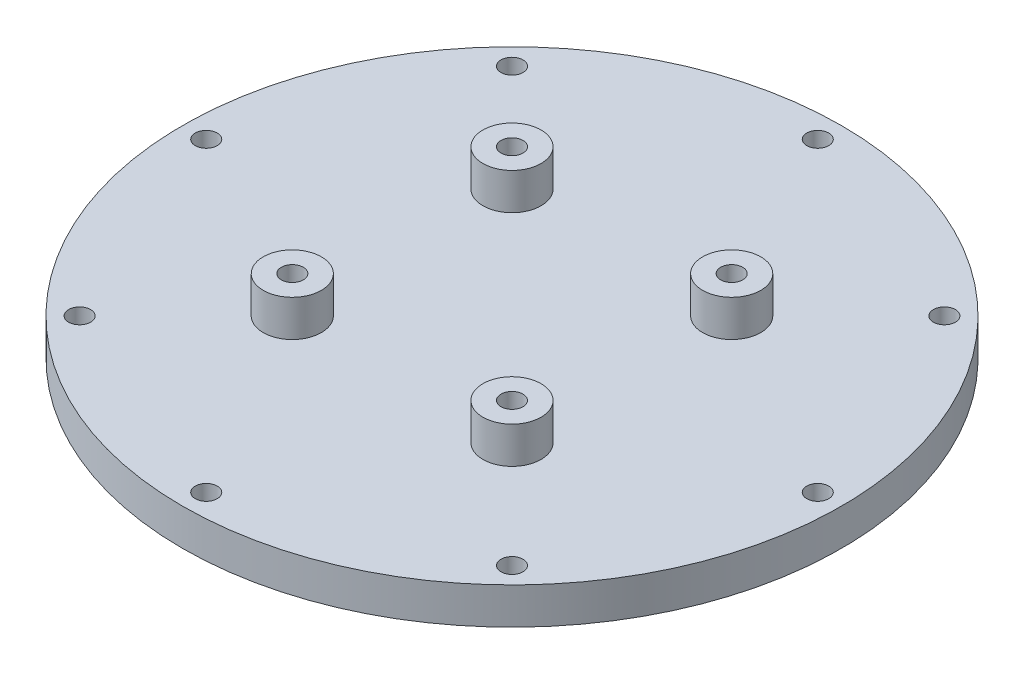
ISO-10303-21;
HEADER;
FILE_DESCRIPTION(('STEP AP214'),'2;1');
FILE_NAME('part.step','',(''),(''),'','','');
FILE_SCHEMA(('AUTOMOTIVE_DESIGN { 1 0 10303 214 1 1 1 1 }'));
ENDSEC;
DATA;
#1=APPLICATION_CONTEXT('core data for automotive mechanical design processes');
#2=APPLICATION_PROTOCOL_DEFINITION('international standard','automotive_design',2000,#1);
#3=PRODUCT_CONTEXT('',#1,'mechanical');
#4=PRODUCT('Part','Part','',(#3));
#5=PRODUCT_RELATED_PRODUCT_CATEGORY('part','',(#4));
#6=PRODUCT_DEFINITION_FORMATION('','',#4);
#7=PRODUCT_DEFINITION_CONTEXT('part definition',#1,'design');
#8=PRODUCT_DEFINITION('design','',#6,#7);
#9=PRODUCT_DEFINITION_SHAPE('','',#8);
#10=(LENGTH_UNIT() NAMED_UNIT(*) SI_UNIT(.MILLI.,.METRE.));
#11=(NAMED_UNIT(*) PLANE_ANGLE_UNIT() SI_UNIT($,.RADIAN.));
#12=(NAMED_UNIT(*) SI_UNIT($,.STERADIAN.) SOLID_ANGLE_UNIT());
#13=UNCERTAINTY_MEASURE_WITH_UNIT(LENGTH_MEASURE(1.E-05),#10,'distance_accuracy_value','');
#14=(GEOMETRIC_REPRESENTATION_CONTEXT(3) GLOBAL_UNCERTAINTY_ASSIGNED_CONTEXT((#13)) GLOBAL_UNIT_ASSIGNED_CONTEXT((#10,
#11,#12)) REPRESENTATION_CONTEXT('',''));
#15=CARTESIAN_POINT('',(0.,0.,0.));
#16=DIRECTION('',(0.,0.,1.));
#17=DIRECTION('',(1.,0.,0.));
#18=AXIS2_PLACEMENT_3D('',#15,#16,#17);
#19=CARTESIAN_POINT('',(0.,5.,0.));
#20=DIRECTION('',(0.,1.,0.));
#21=DIRECTION('',(0.,0.,1.));
#22=AXIS2_PLACEMENT_3D('',#19,#20,#21);
#23=PLANE('',#22);
#24=CARTESIAN_POINT('',(-14.9999999999997,5.,15.));
#25=DIRECTION('',(0.,1.,0.));
#26=DIRECTION('',(0.,0.,1.));
#27=AXIS2_PLACEMENT_3D('',#24,#25,#26);
#28=CIRCLE('',#27,3.96875);
#29=CARTESIAN_POINT('',(-14.9999999999997,5.,18.96875));
#30=VERTEX_POINT('',#29);
#31=EDGE_CURVE('E139',#30,#30,#28,.T.);
#32=ORIENTED_EDGE('',*,*,#31,.F.);
#33=EDGE_LOOP('',(#32));
#34=FACE_BOUND('',#33,.T.);
#35=CARTESIAN_POINT('',(15.0000000000003,5.,15.));
#36=DIRECTION('',(0.,1.,0.));
#37=DIRECTION('',(0.,0.,1.));
#38=AXIS2_PLACEMENT_3D('',#35,#36,#37);
#39=CIRCLE('',#38,3.96875);
#40=CARTESIAN_POINT('',(15.0000000000003,5.,18.96875));
#41=VERTEX_POINT('',#40);
#42=EDGE_CURVE('E153',#41,#41,#39,.T.);
#43=ORIENTED_EDGE('',*,*,#42,.F.);
#44=EDGE_LOOP('',(#43));
#45=FACE_BOUND('',#44,.T.);
#46=CARTESIAN_POINT('',(15.,5.,-15.));
#47=DIRECTION('',(0.,1.,0.));
#48=DIRECTION('',(0.,0.,1.));
#49=AXIS2_PLACEMENT_3D('',#46,#47,#48);
#50=CIRCLE('',#49,3.96875);
#51=CARTESIAN_POINT('',(15.,5.,-11.03125));
#52=VERTEX_POINT('',#51);
#53=EDGE_CURVE('E163',#52,#52,#50,.T.);
#54=ORIENTED_EDGE('',*,*,#53,.F.);
#55=EDGE_LOOP('',(#54));
#56=FACE_BOUND('',#55,.T.);
#57=CARTESIAN_POINT('',(-15.,5.,-15.));
#58=DIRECTION('',(0.,1.,0.));
#59=DIRECTION('',(0.,0.,1.));
#60=AXIS2_PLACEMENT_3D('',#57,#58,#59);
#61=CIRCLE('',#60,3.96875);
#62=CARTESIAN_POINT('',(-15.,5.,-11.03125));
#63=VERTEX_POINT('',#62);
#64=EDGE_CURVE('E122',#63,#63,#61,.T.);
#65=ORIENTED_EDGE('',*,*,#64,.F.);
#66=EDGE_LOOP('',(#65));
#67=FACE_BOUND('',#66,.T.);
#68=CARTESIAN_POINT('',(-41.7499999999995,5.,7.55688533465481E-13));
#69=DIRECTION('',(0.,1.,0.));
#70=DIRECTION('',(0.,0.,1.));
#71=AXIS2_PLACEMENT_3D('',#68,#69,#70);
#72=CIRCLE('',#71,1.50000000000129);
#73=CARTESIAN_POINT('',(-41.7499999999995,5.,1.50000000000205));
#74=VERTEX_POINT('',#73);
#75=EDGE_CURVE('E102',#74,#74,#72,.T.);
#76=ORIENTED_EDGE('',*,*,#75,.F.);
#77=EDGE_LOOP('',(#76));
#78=FACE_BOUND('',#77,.T.);
#79=CARTESIAN_POINT('',(2.52321384578816E-12,5.,41.7500000000013));
#80=DIRECTION('',(0.,1.,0.));
#81=DIRECTION('',(0.,0.,1.));
#82=AXIS2_PLACEMENT_3D('',#79,#80,#81);
#83=CIRCLE('',#82,1.50000000000233);
#84=CARTESIAN_POINT('',(2.52321384578816E-12,5.,43.2500000000036));
#85=VERTEX_POINT('',#84);
#86=EDGE_CURVE('E86',#85,#85,#83,.T.);
#87=ORIENTED_EDGE('',*,*,#86,.F.);
#88=EDGE_LOOP('',(#87));
#89=FACE_BOUND('',#88,.T.);
#90=CARTESIAN_POINT('',(41.750000000003,5.,-7.50575633079041E-13));
#91=DIRECTION('',(0.,1.,0.));
#92=DIRECTION('',(0.,0.,1.));
#93=AXIS2_PLACEMENT_3D('',#90,#91,#92);
#94=CIRCLE('',#93,1.49999999999997);
#95=CARTESIAN_POINT('',(41.750000000003,5.,1.49999999999922));
#96=VERTEX_POINT('',#95);
#97=EDGE_CURVE('E70',#96,#96,#94,.T.);
#98=ORIENTED_EDGE('',*,*,#97,.F.);
#99=EDGE_LOOP('',(#98));
#100=FACE_BOUND('',#99,.T.);
#101=CARTESIAN_POINT('',(1.02206257963007E-12,5.,-41.7500000000013));
#102=DIRECTION('',(0.,1.,0.));
#103=DIRECTION('',(0.,0.,1.));
#104=AXIS2_PLACEMENT_3D('',#101,#102,#103);
#105=CIRCLE('',#104,1.49999999999866);
#106=CARTESIAN_POINT('',(1.02206257963007E-12,5.,-40.2500000000026));
#107=VERTEX_POINT('',#106);
#108=EDGE_CURVE('E56',#107,#107,#105,.T.);
#109=ORIENTED_EDGE('',*,*,#108,.F.);
#110=EDGE_LOOP('',(#109));
#111=FACE_BOUND('',#110,.T.);
#112=CARTESIAN_POINT('',(0.,5.,0.));
#113=DIRECTION('',(0.,1.,0.));
#114=DIRECTION('',(0.,0.,1.));
#115=AXIS2_PLACEMENT_3D('',#112,#113,#114);
#116=CIRCLE('',#115,45.);
#117=CARTESIAN_POINT('',(0.,5.,45.));
#118=VERTEX_POINT('',#117);
#119=EDGE_CURVE('E10',#118,#118,#116,.T.);
#120=ORIENTED_EDGE('',*,*,#119,.T.);
#121=EDGE_LOOP('',(#120));
#122=FACE_BOUND('',#121,.T.);
#123=CARTESIAN_POINT('',(29.5217081145405,5.,-29.5217081145398));
#124=DIRECTION('',(0.,1.,0.));
#125=DIRECTION('',(0.,0.,1.));
#126=AXIS2_PLACEMENT_3D('',#123,#124,#125);
#127=CIRCLE('',#126,1.49999999999886);
#128=CARTESIAN_POINT('',(29.5217081145405,5.,-28.0217081145409));
#129=VERTEX_POINT('',#128);
#130=EDGE_CURVE('E62',#129,#129,#127,.T.);
#131=ORIENTED_EDGE('',*,*,#130,.F.);
#132=EDGE_LOOP('',(#131));
#133=FACE_BOUND('',#132,.T.);
#134=CARTESIAN_POINT('',(29.5217081145415,5.,29.5217081145387));
#135=DIRECTION('',(0.,1.,0.));
#136=DIRECTION('',(0.,0.,1.));
#137=AXIS2_PLACEMENT_3D('',#134,#135,#136);
#138=CIRCLE('',#137,1.5000000000014);
#139=CARTESIAN_POINT('',(29.5217081145415,5.,31.0217081145401));
#140=VERTEX_POINT('',#139);
#141=EDGE_CURVE('E78',#140,#140,#138,.T.);
#142=ORIENTED_EDGE('',*,*,#141,.F.);
#143=EDGE_LOOP('',(#142));
#144=FACE_BOUND('',#143,.T.);
#145=CARTESIAN_POINT('',(-29.5217081145369,5.,29.5217081145398));
#146=DIRECTION('',(0.,1.,0.));
#147=DIRECTION('',(0.,0.,1.));
#148=AXIS2_PLACEMENT_3D('',#145,#146,#147);
#149=CIRCLE('',#148,1.50000000000227);
#150=CARTESIAN_POINT('',(-29.5217081145369,5.,31.021708114542));
#151=VERTEX_POINT('',#150);
#152=EDGE_CURVE('E94',#151,#151,#149,.T.);
#153=ORIENTED_EDGE('',*,*,#152,.F.);
#154=EDGE_LOOP('',(#153));
#155=FACE_BOUND('',#154,.T.);
#156=CARTESIAN_POINT('',(-29.521708114538,5.,-29.5217081145387));
#157=DIRECTION('',(0.,1.,0.));
#158=DIRECTION('',(0.,0.,1.));
#159=AXIS2_PLACEMENT_3D('',#156,#157,#158);
#160=CIRCLE('',#159,1.5);
#161=CARTESIAN_POINT('',(-29.521708114538,5.,-28.0217081145387));
#162=VERTEX_POINT('',#161);
#163=EDGE_CURVE('E110',#162,#162,#160,.T.);
#164=ORIENTED_EDGE('',*,*,#163,.F.);
#165=EDGE_LOOP('',(#164));
#166=FACE_BOUND('',#165,.T.);
#167=ADVANCED_FACE('F43',(#34,#45,#56,#67,#78,#89,#100,#111,#122,#133,#144,#155,#166),#23,.T.);
#168=CARTESIAN_POINT('',(0.,0.,0.));
#169=DIRECTION('',(0.,1.,0.));
#170=DIRECTION('',(0.,0.,1.));
#171=AXIS2_PLACEMENT_3D('',#168,#169,#170);
#172=PLANE('',#171);
#173=CARTESIAN_POINT('',(0.,0.,0.));
#174=DIRECTION('',(0.,1.,0.));
#175=DIRECTION('',(0.,0.,1.));
#176=AXIS2_PLACEMENT_3D('',#173,#174,#175);
#177=CIRCLE('',#176,45.);
#178=CARTESIAN_POINT('',(0.,0.,45.));
#179=VERTEX_POINT('',#178);
#180=EDGE_CURVE('E47',#179,#179,#177,.T.);
#181=ORIENTED_EDGE('',*,*,#180,.F.);
#182=EDGE_LOOP('',(#181));
#183=FACE_BOUND('',#182,.T.);
#184=CARTESIAN_POINT('',(1.02206257963007E-12,0.,-41.7500000000013));
#185=DIRECTION('',(0.,1.,0.));
#186=DIRECTION('',(0.,0.,1.));
#187=AXIS2_PLACEMENT_3D('',#184,#185,#186);
#188=CIRCLE('',#187,1.49999999999866);
#189=CARTESIAN_POINT('',(1.02206257963007E-12,0.,-40.2500000000026));
#190=VERTEX_POINT('',#189);
#191=EDGE_CURVE('E58',#190,#190,#188,.T.);
#192=ORIENTED_EDGE('',*,*,#191,.T.);
#193=EDGE_LOOP('',(#192));
#194=FACE_BOUND('',#193,.T.);
#195=CARTESIAN_POINT('',(29.5217081145405,0.,-29.5217081145398));
#196=DIRECTION('',(0.,1.,0.));
#197=DIRECTION('',(0.,0.,1.));
#198=AXIS2_PLACEMENT_3D('',#195,#196,#197);
#199=CIRCLE('',#198,1.49999999999886);
#200=CARTESIAN_POINT('',(29.5217081145405,0.,-28.0217081145409));
#201=VERTEX_POINT('',#200);
#202=EDGE_CURVE('E66',#201,#201,#199,.T.);
#203=ORIENTED_EDGE('',*,*,#202,.T.);
#204=EDGE_LOOP('',(#203));
#205=FACE_BOUND('',#204,.T.);
#206=CARTESIAN_POINT('',(41.750000000003,0.,-7.50575633079041E-13));
#207=DIRECTION('',(0.,1.,0.));
#208=DIRECTION('',(0.,0.,1.));
#209=AXIS2_PLACEMENT_3D('',#206,#207,#208);
#210=CIRCLE('',#209,1.49999999999997);
#211=CARTESIAN_POINT('',(41.750000000003,0.,1.49999999999922));
#212=VERTEX_POINT('',#211);
#213=EDGE_CURVE('E74',#212,#212,#210,.T.);
#214=ORIENTED_EDGE('',*,*,#213,.T.);
#215=EDGE_LOOP('',(#214));
#216=FACE_BOUND('',#215,.T.);
#217=CARTESIAN_POINT('',(29.5217081145415,0.,29.5217081145387));
#218=DIRECTION('',(0.,1.,0.));
#219=DIRECTION('',(0.,0.,1.));
#220=AXIS2_PLACEMENT_3D('',#217,#218,#219);
#221=CIRCLE('',#220,1.5000000000014);
#222=CARTESIAN_POINT('',(29.5217081145415,0.,31.0217081145401));
#223=VERTEX_POINT('',#222);
#224=EDGE_CURVE('E82',#223,#223,#221,.T.);
#225=ORIENTED_EDGE('',*,*,#224,.T.);
#226=EDGE_LOOP('',(#225));
#227=FACE_BOUND('',#226,.T.);
#228=CARTESIAN_POINT('',(2.52321384578816E-12,0.,41.7500000000013));
#229=DIRECTION('',(0.,1.,0.));
#230=DIRECTION('',(0.,0.,1.));
#231=AXIS2_PLACEMENT_3D('',#228,#229,#230);
#232=CIRCLE('',#231,1.50000000000233);
#233=CARTESIAN_POINT('',(2.52321384578816E-12,0.,43.2500000000036));
#234=VERTEX_POINT('',#233);
#235=EDGE_CURVE('E90',#234,#234,#232,.T.);
#236=ORIENTED_EDGE('',*,*,#235,.T.);
#237=EDGE_LOOP('',(#236));
#238=FACE_BOUND('',#237,.T.);
#239=CARTESIAN_POINT('',(-29.5217081145369,0.,29.5217081145398));
#240=DIRECTION('',(0.,1.,0.));
#241=DIRECTION('',(0.,0.,1.));
#242=AXIS2_PLACEMENT_3D('',#239,#240,#241);
#243=CIRCLE('',#242,1.50000000000227);
#244=CARTESIAN_POINT('',(-29.5217081145369,0.,31.021708114542));
#245=VERTEX_POINT('',#244);
#246=EDGE_CURVE('E98',#245,#245,#243,.T.);
#247=ORIENTED_EDGE('',*,*,#246,.T.);
#248=EDGE_LOOP('',(#247));
#249=FACE_BOUND('',#248,.T.);
#250=CARTESIAN_POINT('',(-41.7499999999995,0.,7.55688533465481E-13));
#251=DIRECTION('',(0.,1.,0.));
#252=DIRECTION('',(0.,0.,1.));
#253=AXIS2_PLACEMENT_3D('',#250,#251,#252);
#254=CIRCLE('',#253,1.50000000000129);
#255=CARTESIAN_POINT('',(-41.7499999999995,0.,1.50000000000205));
#256=VERTEX_POINT('',#255);
#257=EDGE_CURVE('E106',#256,#256,#254,.T.);
#258=ORIENTED_EDGE('',*,*,#257,.T.);
#259=EDGE_LOOP('',(#258));
#260=FACE_BOUND('',#259,.T.);
#261=CARTESIAN_POINT('',(-29.521708114538,0.,-29.5217081145387));
#262=DIRECTION('',(0.,1.,0.));
#263=DIRECTION('',(0.,0.,1.));
#264=AXIS2_PLACEMENT_3D('',#261,#262,#263);
#265=CIRCLE('',#264,1.5);
#266=CARTESIAN_POINT('',(-29.521708114538,0.,-28.0217081145387));
#267=VERTEX_POINT('',#266);
#268=EDGE_CURVE('E114',#267,#267,#265,.T.);
#269=ORIENTED_EDGE('',*,*,#268,.T.);
#270=EDGE_LOOP('',(#269));
#271=FACE_BOUND('',#270,.T.);
#272=ADVANCED_FACE('F209',(#183,#194,#205,#216,#227,#238,#249,#260,#271),#172,.F.);
#273=CARTESIAN_POINT('',(0.,5.,0.));
#274=DIRECTION('',(0.,-1.,0.));
#275=DIRECTION('',(0.,0.,-1.));
#276=AXIS2_PLACEMENT_3D('',#273,#274,#275);
#277=CYLINDRICAL_SURFACE('',#276,45.);
#278=ORIENTED_EDGE('',*,*,#119,.F.);
#279=EDGE_LOOP('',(#278));
#280=FACE_BOUND('',#279,.T.);
#281=ORIENTED_EDGE('',*,*,#180,.T.);
#282=EDGE_LOOP('',(#281));
#283=FACE_BOUND('',#282,.T.);
#284=ADVANCED_FACE('F45',(#280,#283),#277,.T.);
#285=CARTESIAN_POINT('',(1.02206257963007E-12,5.,-41.7500000000013));
#286=DIRECTION('',(0.,-1.,0.));
#287=DIRECTION('',(0.,0.,-1.));
#288=AXIS2_PLACEMENT_3D('',#285,#286,#287);
#289=CYLINDRICAL_SURFACE('',#288,1.49999999999866);
#290=ORIENTED_EDGE('',*,*,#108,.T.);
#291=EDGE_LOOP('',(#290));
#292=FACE_BOUND('',#291,.T.);
#293=ORIENTED_EDGE('',*,*,#191,.F.);
#294=EDGE_LOOP('',(#293));
#295=FACE_BOUND('',#294,.T.);
#296=ADVANCED_FACE('F221',(#292,#295),#289,.F.);
#297=CARTESIAN_POINT('',(29.5217081145405,5.,-29.5217081145398));
#298=DIRECTION('',(0.,-1.,0.));
#299=DIRECTION('',(0.,0.,-1.));
#300=AXIS2_PLACEMENT_3D('',#297,#298,#299);
#301=CYLINDRICAL_SURFACE('',#300,1.49999999999886);
#302=ORIENTED_EDGE('',*,*,#130,.T.);
#303=EDGE_LOOP('',(#302));
#304=FACE_BOUND('',#303,.T.);
#305=ORIENTED_EDGE('',*,*,#202,.F.);
#306=EDGE_LOOP('',(#305));
#307=FACE_BOUND('',#306,.T.);
#308=ADVANCED_FACE('F224',(#304,#307),#301,.F.);
#309=CARTESIAN_POINT('',(41.750000000003,5.,-7.50575633079041E-13));
#310=DIRECTION('',(0.,-1.,0.));
#311=DIRECTION('',(0.,0.,-1.));
#312=AXIS2_PLACEMENT_3D('',#309,#310,#311);
#313=CYLINDRICAL_SURFACE('',#312,1.49999999999997);
#314=ORIENTED_EDGE('',*,*,#97,.T.);
#315=EDGE_LOOP('',(#314));
#316=FACE_BOUND('',#315,.T.);
#317=ORIENTED_EDGE('',*,*,#213,.F.);
#318=EDGE_LOOP('',(#317));
#319=FACE_BOUND('',#318,.T.);
#320=ADVANCED_FACE('F228',(#316,#319),#313,.F.);
#321=CARTESIAN_POINT('',(29.5217081145415,5.,29.5217081145387));
#322=DIRECTION('',(0.,-1.,0.));
#323=DIRECTION('',(0.,0.,-1.));
#324=AXIS2_PLACEMENT_3D('',#321,#322,#323);
#325=CYLINDRICAL_SURFACE('',#324,1.5000000000014);
#326=ORIENTED_EDGE('',*,*,#141,.T.);
#327=EDGE_LOOP('',(#326));
#328=FACE_BOUND('',#327,.T.);
#329=ORIENTED_EDGE('',*,*,#224,.F.);
#330=EDGE_LOOP('',(#329));
#331=FACE_BOUND('',#330,.T.);
#332=ADVANCED_FACE('F232',(#328,#331),#325,.F.);
#333=CARTESIAN_POINT('',(2.52321384578816E-12,5.,41.7500000000013));
#334=DIRECTION('',(0.,-1.,0.));
#335=DIRECTION('',(0.,0.,-1.));
#336=AXIS2_PLACEMENT_3D('',#333,#334,#335);
#337=CYLINDRICAL_SURFACE('',#336,1.50000000000233);
#338=ORIENTED_EDGE('',*,*,#86,.T.);
#339=EDGE_LOOP('',(#338));
#340=FACE_BOUND('',#339,.T.);
#341=ORIENTED_EDGE('',*,*,#235,.F.);
#342=EDGE_LOOP('',(#341));
#343=FACE_BOUND('',#342,.T.);
#344=ADVANCED_FACE('F236',(#340,#343),#337,.F.);
#345=CARTESIAN_POINT('',(-29.5217081145369,5.,29.5217081145398));
#346=DIRECTION('',(0.,-1.,0.));
#347=DIRECTION('',(0.,0.,-1.));
#348=AXIS2_PLACEMENT_3D('',#345,#346,#347);
#349=CYLINDRICAL_SURFACE('',#348,1.50000000000227);
#350=ORIENTED_EDGE('',*,*,#152,.T.);
#351=EDGE_LOOP('',(#350));
#352=FACE_BOUND('',#351,.T.);
#353=ORIENTED_EDGE('',*,*,#246,.F.);
#354=EDGE_LOOP('',(#353));
#355=FACE_BOUND('',#354,.T.);
#356=ADVANCED_FACE('F240',(#352,#355),#349,.F.);
#357=CARTESIAN_POINT('',(-41.7499999999995,5.,7.55688533465481E-13));
#358=DIRECTION('',(0.,-1.,0.));
#359=DIRECTION('',(0.,0.,-1.));
#360=AXIS2_PLACEMENT_3D('',#357,#358,#359);
#361=CYLINDRICAL_SURFACE('',#360,1.50000000000129);
#362=ORIENTED_EDGE('',*,*,#75,.T.);
#363=EDGE_LOOP('',(#362));
#364=FACE_BOUND('',#363,.T.);
#365=ORIENTED_EDGE('',*,*,#257,.F.);
#366=EDGE_LOOP('',(#365));
#367=FACE_BOUND('',#366,.T.);
#368=ADVANCED_FACE('F244',(#364,#367),#361,.F.);
#369=CARTESIAN_POINT('',(-29.521708114538,5.,-29.5217081145387));
#370=DIRECTION('',(0.,-1.,0.));
#371=DIRECTION('',(0.,0.,-1.));
#372=AXIS2_PLACEMENT_3D('',#369,#370,#371);
#373=CYLINDRICAL_SURFACE('',#372,1.5);
#374=ORIENTED_EDGE('',*,*,#163,.T.);
#375=EDGE_LOOP('',(#374));
#376=FACE_BOUND('',#375,.T.);
#377=ORIENTED_EDGE('',*,*,#268,.F.);
#378=EDGE_LOOP('',(#377));
#379=FACE_BOUND('',#378,.T.);
#380=ADVANCED_FACE('F248',(#376,#379),#373,.F.);
#381=CARTESIAN_POINT('',(-15.,10.,-15.));
#382=DIRECTION('',(0.,1.,0.));
#383=DIRECTION('',(0.,0.,1.));
#384=AXIS2_PLACEMENT_3D('',#381,#382,#383);
#385=PLANE('',#384);
#386=CARTESIAN_POINT('',(-15.,10.,-15.));
#387=DIRECTION('',(0.,1.,0.));
#388=DIRECTION('',(0.,0.,1.));
#389=AXIS2_PLACEMENT_3D('',#386,#387,#388);
#390=CIRCLE('',#389,3.96875);
#391=CARTESIAN_POINT('',(-15.,10.,-11.03125));
#392=VERTEX_POINT('',#391);
#393=EDGE_CURVE('E118',#392,#392,#390,.T.);
#394=ORIENTED_EDGE('',*,*,#393,.T.);
#395=EDGE_LOOP('',(#394));
#396=FACE_BOUND('',#395,.T.);
#397=CARTESIAN_POINT('',(-15.,10.,-15.));
#398=DIRECTION('',(0.,1.,0.));
#399=DIRECTION('',(0.,0.,1.));
#400=AXIS2_PLACEMENT_3D('',#397,#398,#399);
#401=CIRCLE('',#400,1.5);
#402=CARTESIAN_POINT('',(-15.,10.,-13.5));
#403=VERTEX_POINT('',#402);
#404=EDGE_CURVE('E126',#403,#403,#401,.T.);
#405=ORIENTED_EDGE('',*,*,#404,.F.);
#406=EDGE_LOOP('',(#405));
#407=FACE_BOUND('',#406,.T.);
#408=ADVANCED_FACE('F251',(#396,#407),#385,.T.);
#409=CARTESIAN_POINT('',(-15.,10.,-15.));
#410=DIRECTION('',(0.,-1.,0.));
#411=DIRECTION('',(0.,0.,-1.));
#412=AXIS2_PLACEMENT_3D('',#409,#410,#411);
#413=CYLINDRICAL_SURFACE('',#412,3.96875);
#414=ORIENTED_EDGE('',*,*,#393,.F.);
#415=EDGE_LOOP('',(#414));
#416=FACE_BOUND('',#415,.T.);
#417=ORIENTED_EDGE('',*,*,#64,.T.);
#418=EDGE_LOOP('',(#417));
#419=FACE_BOUND('',#418,.T.);
#420=ADVANCED_FACE('F253',(#416,#419),#413,.T.);
#421=CARTESIAN_POINT('',(-15.,10.,-15.));
#422=DIRECTION('',(0.,-1.,0.));
#423=DIRECTION('',(0.,0.,-1.));
#424=AXIS2_PLACEMENT_3D('',#421,#422,#423);
#425=CYLINDRICAL_SURFACE('',#424,1.5);
#426=ORIENTED_EDGE('',*,*,#404,.T.);
#427=EDGE_LOOP('',(#426));
#428=FACE_BOUND('',#427,.T.);
#429=CARTESIAN_POINT('',(-15.,3.,-15.));
#430=DIRECTION('',(0.,1.,0.));
#431=DIRECTION('',(0.,0.,1.));
#432=AXIS2_PLACEMENT_3D('',#429,#430,#431);
#433=CIRCLE('',#432,1.5);
#434=CARTESIAN_POINT('',(-15.,3.,-13.5));
#435=VERTEX_POINT('',#434);
#436=EDGE_CURVE('E144',#435,#435,#433,.T.);
#437=ORIENTED_EDGE('',*,*,#436,.F.);
#438=EDGE_LOOP('',(#437));
#439=FACE_BOUND('',#438,.T.);
#440=ADVANCED_FACE('F256',(#428,#439),#425,.F.);
#441=CARTESIAN_POINT('',(15.,10.,-15.));
#442=DIRECTION('',(0.,1.,0.));
#443=DIRECTION('',(0.,0.,1.));
#444=AXIS2_PLACEMENT_3D('',#441,#442,#443);
#445=PLANE('',#444);
#446=CARTESIAN_POINT('',(15.,10.,-15.));
#447=DIRECTION('',(0.,1.,0.));
#448=DIRECTION('',(0.,0.,1.));
#449=AXIS2_PLACEMENT_3D('',#446,#447,#448);
#450=CIRCLE('',#449,3.96875);
#451=CARTESIAN_POINT('',(15.,10.,-11.03125));
#452=VERTEX_POINT('',#451);
#453=EDGE_CURVE('E152',#452,#452,#450,.T.);
#454=ORIENTED_EDGE('',*,*,#453,.T.);
#455=EDGE_LOOP('',(#454));
#456=FACE_BOUND('',#455,.T.);
#457=CARTESIAN_POINT('',(15.,10.,-15.));
#458=DIRECTION('',(0.,1.,0.));
#459=DIRECTION('',(0.,0.,1.));
#460=AXIS2_PLACEMENT_3D('',#457,#458,#459);
#461=CIRCLE('',#460,1.5);
#462=CARTESIAN_POINT('',(15.,10.,-13.5));
#463=VERTEX_POINT('',#462);
#464=EDGE_CURVE('E133',#463,#463,#461,.T.);
#465=ORIENTED_EDGE('',*,*,#464,.F.);
#466=EDGE_LOOP('',(#465));
#467=FACE_BOUND('',#466,.T.);
#468=ADVANCED_FACE('F203',(#456,#467),#445,.T.);
#469=CARTESIAN_POINT('',(15.,10.,-15.));
#470=DIRECTION('',(0.,-1.,0.));
#471=DIRECTION('',(0.,0.,-1.));
#472=AXIS2_PLACEMENT_3D('',#469,#470,#471);
#473=CYLINDRICAL_SURFACE('',#472,3.96875);
#474=ORIENTED_EDGE('',*,*,#453,.F.);
#475=EDGE_LOOP('',(#474));
#476=FACE_BOUND('',#475,.T.);
#477=ORIENTED_EDGE('',*,*,#53,.T.);
#478=EDGE_LOOP('',(#477));
#479=FACE_BOUND('',#478,.T.);
#480=ADVANCED_FACE('F191',(#476,#479),#473,.T.);
#481=CARTESIAN_POINT('',(15.,10.,-15.));
#482=DIRECTION('',(0.,-1.,0.));
#483=DIRECTION('',(0.,0.,-1.));
#484=AXIS2_PLACEMENT_3D('',#481,#482,#483);
#485=CYLINDRICAL_SURFACE('',#484,1.5);
#486=ORIENTED_EDGE('',*,*,#464,.T.);
#487=EDGE_LOOP('',(#486));
#488=FACE_BOUND('',#487,.T.);
#489=CARTESIAN_POINT('',(15.,3.,-15.));
#490=DIRECTION('',(0.,1.,0.));
#491=DIRECTION('',(0.,0.,1.));
#492=AXIS2_PLACEMENT_3D('',#489,#490,#491);
#493=CIRCLE('',#492,1.5);
#494=CARTESIAN_POINT('',(15.,3.,-13.5));
#495=VERTEX_POINT('',#494);
#496=EDGE_CURVE('E173',#495,#495,#493,.T.);
#497=ORIENTED_EDGE('',*,*,#496,.F.);
#498=EDGE_LOOP('',(#497));
#499=FACE_BOUND('',#498,.T.);
#500=ADVANCED_FACE('F188',(#488,#499),#485,.F.);
#501=CARTESIAN_POINT('',(15.0000000000003,10.,15.));
#502=DIRECTION('',(0.,1.,0.));
#503=DIRECTION('',(0.,0.,1.));
#504=AXIS2_PLACEMENT_3D('',#501,#502,#503);
#505=PLANE('',#504);
#506=CARTESIAN_POINT('',(15.0000000000003,10.,15.));
#507=DIRECTION('',(0.,1.,0.));
#508=DIRECTION('',(0.,0.,1.));
#509=AXIS2_PLACEMENT_3D('',#506,#507,#508);
#510=CIRCLE('',#509,3.96875);
#511=CARTESIAN_POINT('',(15.0000000000003,10.,18.96875));
#512=VERTEX_POINT('',#511);
#513=EDGE_CURVE('E138',#512,#512,#510,.T.);
#514=ORIENTED_EDGE('',*,*,#513,.T.);
#515=EDGE_LOOP('',(#514));
#516=FACE_BOUND('',#515,.T.);
#517=CARTESIAN_POINT('',(15.0000000000003,10.,15.));
#518=DIRECTION('',(0.,1.,0.));
#519=DIRECTION('',(0.,0.,1.));
#520=AXIS2_PLACEMENT_3D('',#517,#518,#519);
#521=CIRCLE('',#520,1.5);
#522=CARTESIAN_POINT('',(15.0000000000003,10.,16.5));
#523=VERTEX_POINT('',#522);
#524=EDGE_CURVE('E148',#523,#523,#521,.T.);
#525=ORIENTED_EDGE('',*,*,#524,.F.);
#526=EDGE_LOOP('',(#525));
#527=FACE_BOUND('',#526,.T.);
#528=ADVANCED_FACE('F190',(#516,#527),#505,.T.);
#529=CARTESIAN_POINT('',(15.0000000000003,10.,15.));
#530=DIRECTION('',(0.,-1.,0.));
#531=DIRECTION('',(0.,0.,-1.));
#532=AXIS2_PLACEMENT_3D('',#529,#530,#531);
#533=CYLINDRICAL_SURFACE('',#532,3.96875);
#534=ORIENTED_EDGE('',*,*,#513,.F.);
#535=EDGE_LOOP('',(#534));
#536=FACE_BOUND('',#535,.T.);
#537=ORIENTED_EDGE('',*,*,#42,.T.);
#538=EDGE_LOOP('',(#537));
#539=FACE_BOUND('',#538,.T.);
#540=ADVANCED_FACE('F199',(#536,#539),#533,.T.);
#541=CARTESIAN_POINT('',(15.0000000000003,10.,15.));
#542=DIRECTION('',(0.,-1.,0.));
#543=DIRECTION('',(0.,0.,-1.));
#544=AXIS2_PLACEMENT_3D('',#541,#542,#543);
#545=CYLINDRICAL_SURFACE('',#544,1.5);
#546=ORIENTED_EDGE('',*,*,#524,.T.);
#547=EDGE_LOOP('',(#546));
#548=FACE_BOUND('',#547,.T.);
#549=CARTESIAN_POINT('',(15.0000000000003,3.,15.));
#550=DIRECTION('',(0.,1.,0.));
#551=DIRECTION('',(0.,0.,1.));
#552=AXIS2_PLACEMENT_3D('',#549,#550,#551);
#553=CIRCLE('',#552,1.5);
#554=CARTESIAN_POINT('',(15.0000000000003,3.,16.5));
#555=VERTEX_POINT('',#554);
#556=EDGE_CURVE('E178',#555,#555,#553,.T.);
#557=ORIENTED_EDGE('',*,*,#556,.F.);
#558=EDGE_LOOP('',(#557));
#559=FACE_BOUND('',#558,.T.);
#560=ADVANCED_FACE('F271',(#548,#559),#545,.F.);
#561=CARTESIAN_POINT('',(-14.9999999999997,10.,15.));
#562=DIRECTION('',(0.,1.,0.));
#563=DIRECTION('',(0.,0.,1.));
#564=AXIS2_PLACEMENT_3D('',#561,#562,#563);
#565=PLANE('',#564);
#566=CARTESIAN_POINT('',(-14.9999999999997,10.,15.));
#567=DIRECTION('',(0.,1.,0.));
#568=DIRECTION('',(0.,0.,1.));
#569=AXIS2_PLACEMENT_3D('',#566,#567,#568);
#570=CIRCLE('',#569,3.96875);
#571=CARTESIAN_POINT('',(-14.9999999999997,10.,18.96875));
#572=VERTEX_POINT('',#571);
#573=EDGE_CURVE('E140',#572,#572,#570,.T.);
#574=ORIENTED_EDGE('',*,*,#573,.T.);
#575=EDGE_LOOP('',(#574));
#576=FACE_BOUND('',#575,.T.);
#577=CARTESIAN_POINT('',(-14.9999999999997,10.,15.));
#578=DIRECTION('',(0.,1.,0.));
#579=DIRECTION('',(0.,0.,1.));
#580=AXIS2_PLACEMENT_3D('',#577,#578,#579);
#581=CIRCLE('',#580,1.5);
#582=CARTESIAN_POINT('',(-14.9999999999997,10.,16.5));
#583=VERTEX_POINT('',#582);
#584=EDGE_CURVE('E134',#583,#583,#581,.T.);
#585=ORIENTED_EDGE('',*,*,#584,.F.);
#586=EDGE_LOOP('',(#585));
#587=FACE_BOUND('',#586,.T.);
#588=ADVANCED_FACE('F268',(#576,#587),#565,.T.);
#589=CARTESIAN_POINT('',(-14.9999999999997,10.,15.));
#590=DIRECTION('',(0.,-1.,0.));
#591=DIRECTION('',(0.,0.,-1.));
#592=AXIS2_PLACEMENT_3D('',#589,#590,#591);
#593=CYLINDRICAL_SURFACE('',#592,3.96875);
#594=ORIENTED_EDGE('',*,*,#573,.F.);
#595=EDGE_LOOP('',(#594));
#596=FACE_BOUND('',#595,.T.);
#597=ORIENTED_EDGE('',*,*,#31,.T.);
#598=EDGE_LOOP('',(#597));
#599=FACE_BOUND('',#598,.T.);
#600=ADVANCED_FACE('F266',(#596,#599),#593,.T.);
#601=CARTESIAN_POINT('',(-14.9999999999997,10.,15.));
#602=DIRECTION('',(0.,-1.,0.));
#603=DIRECTION('',(0.,0.,-1.));
#604=AXIS2_PLACEMENT_3D('',#601,#602,#603);
#605=CYLINDRICAL_SURFACE('',#604,1.5);
#606=ORIENTED_EDGE('',*,*,#584,.T.);
#607=EDGE_LOOP('',(#606));
#608=FACE_BOUND('',#607,.T.);
#609=CARTESIAN_POINT('',(-14.9999999999997,3.,15.));
#610=DIRECTION('',(0.,1.,0.));
#611=DIRECTION('',(0.,0.,1.));
#612=AXIS2_PLACEMENT_3D('',#609,#610,#611);
#613=CIRCLE('',#612,1.5);
#614=CARTESIAN_POINT('',(-14.9999999999997,3.,16.5));
#615=VERTEX_POINT('',#614);
#616=EDGE_CURVE('E174',#615,#615,#613,.T.);
#617=ORIENTED_EDGE('',*,*,#616,.F.);
#618=EDGE_LOOP('',(#617));
#619=FACE_BOUND('',#618,.T.);
#620=ADVANCED_FACE('F262',(#608,#619),#605,.F.);
#621=CARTESIAN_POINT('',(-14.9999999999997,3.,15.));
#622=DIRECTION('',(0.,1.,0.));
#623=DIRECTION('',(0.,0.,1.));
#624=AXIS2_PLACEMENT_3D('',#621,#622,#623);
#625=PLANE('',#624);
#626=ORIENTED_EDGE('',*,*,#616,.T.);
#627=EDGE_LOOP('',(#626));
#628=FACE_BOUND('',#627,.T.);
#629=ADVANCED_FACE('F265',(#628),#625,.T.);
#630=CARTESIAN_POINT('',(15.0000000000003,3.,15.));
#631=DIRECTION('',(0.,1.,0.));
#632=DIRECTION('',(0.,0.,1.));
#633=AXIS2_PLACEMENT_3D('',#630,#631,#632);
#634=PLANE('',#633);
#635=ORIENTED_EDGE('',*,*,#556,.T.);
#636=EDGE_LOOP('',(#635));
#637=FACE_BOUND('',#636,.T.);
#638=ADVANCED_FACE('F335',(#637),#634,.T.);
#639=CARTESIAN_POINT('',(0.,3.,0.));
#640=DIRECTION('',(0.,1.,0.));
#641=DIRECTION('',(0.,0.,1.));
#642=AXIS2_PLACEMENT_3D('',#639,#640,#641);
#643=PLANE('',#642);
#644=ORIENTED_EDGE('',*,*,#496,.T.);
#645=EDGE_LOOP('',(#644));
#646=FACE_BOUND('',#645,.T.);
#647=ADVANCED_FACE('F186',(#646),#643,.T.);
#648=CARTESIAN_POINT('',(0.,3.,0.));
#649=DIRECTION('',(0.,1.,0.));
#650=DIRECTION('',(0.,0.,1.));
#651=AXIS2_PLACEMENT_3D('',#648,#649,#650);
#652=PLANE('',#651);
#653=ORIENTED_EDGE('',*,*,#436,.T.);
#654=EDGE_LOOP('',(#653));
#655=FACE_BOUND('',#654,.T.);
#656=ADVANCED_FACE('F342',(#655),#652,.T.);
#657=CLOSED_SHELL('',(#167,#272,#284,#296,#308,#320,#332,#344,#356,#368,#380,#408,#420,#440,
#468,#480,#500,#528,#540,#560,#588,#600,#620,#629,#638,#647,#656));
#658=MANIFOLD_SOLID_BREP('B2',#657);
#659=ADVANCED_BREP_SHAPE_REPRESENTATION('',(#18,#658),#14);
#660=SHAPE_DEFINITION_REPRESENTATION(#9,#659);
ENDSEC;
END-ISO-10303-21;
